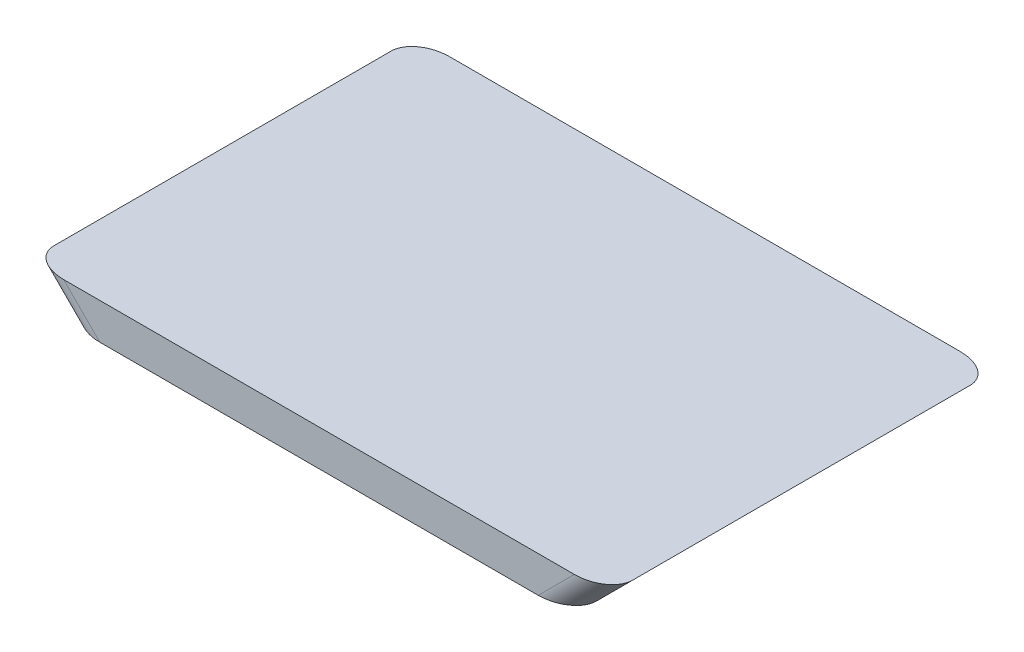
ISO-10303-21;
HEADER;
FILE_DESCRIPTION(('STEP AP214'),'2;1');
FILE_NAME('part.step','',(''),(''),'','','');
FILE_SCHEMA(('AUTOMOTIVE_DESIGN { 1 0 10303 214 1 1 1 1 }'));
ENDSEC;
DATA;
#1=APPLICATION_CONTEXT('core data for automotive mechanical design processes');
#2=APPLICATION_PROTOCOL_DEFINITION('international standard','automotive_design',2000,#1);
#3=PRODUCT_CONTEXT('',#1,'mechanical');
#4=PRODUCT('Part','Part','',(#3));
#5=PRODUCT_RELATED_PRODUCT_CATEGORY('part','',(#4));
#6=PRODUCT_DEFINITION_FORMATION('','',#4);
#7=PRODUCT_DEFINITION_CONTEXT('part definition',#1,'design');
#8=PRODUCT_DEFINITION('design','',#6,#7);
#9=PRODUCT_DEFINITION_SHAPE('','',#8);
#10=(LENGTH_UNIT() NAMED_UNIT(*) SI_UNIT(.MILLI.,.METRE.));
#11=(NAMED_UNIT(*) PLANE_ANGLE_UNIT() SI_UNIT($,.RADIAN.));
#12=(NAMED_UNIT(*) SI_UNIT($,.STERADIAN.) SOLID_ANGLE_UNIT());
#13=UNCERTAINTY_MEASURE_WITH_UNIT(LENGTH_MEASURE(1.E-05),#10,'distance_accuracy_value','');
#14=(GEOMETRIC_REPRESENTATION_CONTEXT(3) GLOBAL_UNCERTAINTY_ASSIGNED_CONTEXT((#13)) GLOBAL_UNIT_ASSIGNED_CONTEXT((#10,
#11,#12)) REPRESENTATION_CONTEXT('',''));
#15=CARTESIAN_POINT('',(0.,0.,0.));
#16=DIRECTION('',(0.,0.,1.));
#17=DIRECTION('',(1.,0.,0.));
#18=AXIS2_PLACEMENT_3D('',#15,#16,#17);
#19=CARTESIAN_POINT('',(-38.1,2.38125000000005,50.8));
#20=DIRECTION('',(0.707106781186564,0.707106781186531,0.));
#21=DIRECTION('',(-0.707106781186531,0.707106781186564,0.));
#22=AXIS2_PLACEMENT_3D('',#19,#20,#21);
#23=PLANE('',#22);
#24=DIRECTION('',(0.,0.,-1.));
#25=VECTOR('',#24,1.);
#26=CARTESIAN_POINT('',(-33.3375000000002,-2.38125,50.8));
#27=LINE('',#26,#25);
#28=CARTESIAN_POINT('',(-33.3375000000002,-2.38125,47.625));
#29=VERTEX_POINT('',#28);
#30=CARTESIAN_POINT('',(-33.3375000000002,-2.38125,3.175));
#31=VERTEX_POINT('',#30);
#32=EDGE_CURVE('E126',#29,#31,#27,.T.);
#33=ORIENTED_EDGE('',*,*,#32,.F.);
#34=DIRECTION('',(0.707106781186531,-0.707106781186564,0.));
#35=VECTOR('',#34,1.);
#36=CARTESIAN_POINT('',(-38.1,2.38125000000005,47.625));
#37=LINE('',#36,#35);
#38=CARTESIAN_POINT('',(-38.1,2.38125000000005,47.625));
#39=VERTEX_POINT('',#38);
#40=EDGE_CURVE('E113',#29,#39,#37,.F.);
#41=ORIENTED_EDGE('',*,*,#40,.T.);
#42=DIRECTION('',(0.,0.,-1.));
#43=VECTOR('',#42,1.);
#44=CARTESIAN_POINT('',(-38.1,2.38125000000005,50.8));
#45=LINE('',#44,#43);
#46=CARTESIAN_POINT('',(-38.1,2.38125000000005,3.175));
#47=VERTEX_POINT('',#46);
#48=EDGE_CURVE('E133',#39,#47,#45,.T.);
#49=ORIENTED_EDGE('',*,*,#48,.T.);
#50=DIRECTION('',(0.707106781186531,-0.707106781186564,0.));
#51=VECTOR('',#50,1.);
#52=CARTESIAN_POINT('',(-33.3375000000002,-2.38125,3.175));
#53=LINE('',#52,#51);
#54=EDGE_CURVE('E168',#47,#31,#53,.T.);
#55=ORIENTED_EDGE('',*,*,#54,.T.);
#56=EDGE_LOOP('',(#33,#41,#49,#55));
#57=FACE_BOUND('',#56,.T.);
#58=ADVANCED_FACE('F43',(#57),#23,.F.);
#59=CARTESIAN_POINT('',(-33.3375000000002,-2.38125,50.8));
#60=DIRECTION('',(0.,1.,0.));
#61=DIRECTION('',(0.,0.,1.));
#62=AXIS2_PLACEMENT_3D('',#59,#60,#61);
#63=PLANE('',#62);
#64=DIRECTION('',(0.,0.,-1.));
#65=VECTOR('',#64,1.);
#66=CARTESIAN_POINT('',(33.3374999999999,-2.38125,50.8));
#67=LINE('',#66,#65);
#68=CARTESIAN_POINT('',(33.3374999999999,-2.38125,47.625));
#69=VERTEX_POINT('',#68);
#70=CARTESIAN_POINT('',(33.3374999999999,-2.38125,3.175));
#71=VERTEX_POINT('',#70);
#72=EDGE_CURVE('E146',#69,#71,#67,.T.);
#73=ORIENTED_EDGE('',*,*,#72,.F.);
#74=CARTESIAN_POINT('',(28.8473719394653,-2.38125,47.625));
#75=DIRECTION('',(0.,1.,0.));
#76=DIRECTION('',(1.,0.,0.));
#77=AXIS2_PLACEMENT_3D('',#74,#75,#76);
#78=ELLIPSE('',#77,4.4901280605346,3.175);
#79=CARTESIAN_POINT('',(28.8473719394653,-2.38125,50.8));
#80=VERTEX_POINT('',#79);
#81=EDGE_CURVE('E114',#69,#80,#78,.F.);
#82=ORIENTED_EDGE('',*,*,#81,.T.);
#83=DIRECTION('',(1.,0.,0.));
#84=VECTOR('',#83,1.);
#85=CARTESIAN_POINT('',(-33.3375000000002,-2.38125,50.8));
#86=LINE('',#85,#84);
#87=CARTESIAN_POINT('',(-28.8473719394657,-2.38125,50.8));
#88=VERTEX_POINT('',#87);
#89=EDGE_CURVE('E121',#88,#80,#86,.T.);
#90=ORIENTED_EDGE('',*,*,#89,.F.);
#91=CARTESIAN_POINT('',(-28.8473719394657,-2.38125,47.625));
#92=DIRECTION('',(0.,1.,0.));
#93=DIRECTION('',(1.,0.,0.));
#94=AXIS2_PLACEMENT_3D('',#91,#92,#93);
#95=ELLIPSE('',#94,4.49012806053447,3.175);
#96=EDGE_CURVE('E66',#88,#29,#95,.F.);
#97=ORIENTED_EDGE('',*,*,#96,.T.);
#98=ORIENTED_EDGE('',*,*,#32,.T.);
#99=CARTESIAN_POINT('',(-28.8473719394657,-2.38125,3.175));
#100=DIRECTION('',(0.,1.,0.));
#101=DIRECTION('',(-1.,0.,0.));
#102=AXIS2_PLACEMENT_3D('',#99,#100,#101);
#103=ELLIPSE('',#102,4.49012806053447,3.175);
#104=CARTESIAN_POINT('',(-28.8473719394657,-2.38125,0.));
#105=VERTEX_POINT('',#104);
#106=EDGE_CURVE('E58',#31,#105,#103,.F.);
#107=ORIENTED_EDGE('',*,*,#106,.T.);
#108=DIRECTION('',(1.,0.,0.));
#109=VECTOR('',#108,1.);
#110=CARTESIAN_POINT('',(-33.3375000000002,-2.38125,0.));
#111=LINE('',#110,#109);
#112=CARTESIAN_POINT('',(28.8473719394653,-2.38125,0.));
#113=VERTEX_POINT('',#112);
#114=EDGE_CURVE('E136',#105,#113,#111,.T.);
#115=ORIENTED_EDGE('',*,*,#114,.T.);
#116=CARTESIAN_POINT('',(28.8473719394653,-2.38125,3.175));
#117=DIRECTION('',(0.,1.,0.));
#118=DIRECTION('',(-1.,0.,0.));
#119=AXIS2_PLACEMENT_3D('',#116,#117,#118);
#120=ELLIPSE('',#119,4.4901280605346,3.175);
#121=EDGE_CURVE('E164',#113,#71,#120,.F.);
#122=ORIENTED_EDGE('',*,*,#121,.T.);
#123=EDGE_LOOP('',(#73,#82,#90,#97,#98,#107,#115,#122));
#124=FACE_BOUND('',#123,.T.);
#125=ADVANCED_FACE('F129',(#124),#63,.F.);
#126=CARTESIAN_POINT('',(38.1,2.38125000000005,50.8));
#127=DIRECTION('',(-0.707106781186544,0.707106781186551,0.));
#128=DIRECTION('',(-0.707106781186551,-0.707106781186544,0.));
#129=AXIS2_PLACEMENT_3D('',#126,#127,#128);
#130=PLANE('',#129);
#131=DIRECTION('',(0.,0.,-1.));
#132=VECTOR('',#131,1.);
#133=CARTESIAN_POINT('',(38.1,2.38125000000005,50.8));
#134=LINE('',#133,#132);
#135=CARTESIAN_POINT('',(38.1,2.38125000000005,47.625));
#136=VERTEX_POINT('',#135);
#137=CARTESIAN_POINT('',(38.1,2.38125000000005,3.175));
#138=VERTEX_POINT('',#137);
#139=EDGE_CURVE('E143',#136,#138,#134,.T.);
#140=ORIENTED_EDGE('',*,*,#139,.F.);
#141=DIRECTION('',(0.707106781186551,0.707106781186544,0.));
#142=VECTOR('',#141,1.);
#143=CARTESIAN_POINT('',(38.1,2.38125000000005,47.625));
#144=LINE('',#143,#142);
#145=EDGE_CURVE('E162',#136,#69,#144,.F.);
#146=ORIENTED_EDGE('',*,*,#145,.T.);
#147=ORIENTED_EDGE('',*,*,#72,.T.);
#148=DIRECTION('',(0.707106781186551,0.707106781186544,0.));
#149=VECTOR('',#148,1.);
#150=CARTESIAN_POINT('',(38.1,2.38125000000005,3.175));
#151=LINE('',#150,#149);
#152=EDGE_CURVE('E159',#71,#138,#151,.T.);
#153=ORIENTED_EDGE('',*,*,#152,.T.);
#154=EDGE_LOOP('',(#140,#146,#147,#153));
#155=FACE_BOUND('',#154,.T.);
#156=ADVANCED_FACE('F180',(#155),#130,.F.);
#157=CARTESIAN_POINT('',(-38.1,2.38125000000005,50.8));
#158=DIRECTION('',(0.,-1.,0.));
#159=DIRECTION('',(0.,0.,-1.));
#160=AXIS2_PLACEMENT_3D('',#157,#158,#159);
#161=PLANE('',#160);
#162=DIRECTION('',(-1.,0.,0.));
#163=VECTOR('',#162,1.);
#164=CARTESIAN_POINT('',(-38.1,2.38125000000005,50.8));
#165=LINE('',#164,#163);
#166=CARTESIAN_POINT('',(33.6098719394654,2.38125000000005,50.8));
#167=VERTEX_POINT('',#166);
#168=CARTESIAN_POINT('',(-33.6098719394655,2.38125000000005,50.8));
#169=VERTEX_POINT('',#168);
#170=EDGE_CURVE('E124',#167,#169,#165,.T.);
#171=ORIENTED_EDGE('',*,*,#170,.F.);
#172=CARTESIAN_POINT('',(33.6098719394654,2.38125000000006,47.625));
#173=DIRECTION('',(0.,-1.,0.));
#174=DIRECTION('',(1.,0.,0.));
#175=AXIS2_PLACEMENT_3D('',#172,#173,#174);
#176=ELLIPSE('',#175,4.4901280605346,3.175);
#177=EDGE_CURVE('E157',#167,#136,#176,.F.);
#178=ORIENTED_EDGE('',*,*,#177,.T.);
#179=ORIENTED_EDGE('',*,*,#139,.T.);
#180=CARTESIAN_POINT('',(33.6098719394654,2.38125000000005,3.175));
#181=DIRECTION('',(0.,-1.,0.));
#182=DIRECTION('',(-1.,0.,0.));
#183=AXIS2_PLACEMENT_3D('',#180,#181,#182);
#184=ELLIPSE('',#183,4.4901280605346,3.175);
#185=CARTESIAN_POINT('',(33.6098719394654,2.38125000000005,0.));
#186=VERTEX_POINT('',#185);
#187=EDGE_CURVE('E151',#138,#186,#184,.F.);
#188=ORIENTED_EDGE('',*,*,#187,.T.);
#189=DIRECTION('',(-1.,0.,0.));
#190=VECTOR('',#189,1.);
#191=CARTESIAN_POINT('',(-38.1,2.38125000000005,0.));
#192=LINE('',#191,#190);
#193=CARTESIAN_POINT('',(-33.6098719394655,2.38125000000005,0.));
#194=VERTEX_POINT('',#193);
#195=EDGE_CURVE('E131',#186,#194,#192,.T.);
#196=ORIENTED_EDGE('',*,*,#195,.T.);
#197=CARTESIAN_POINT('',(-33.6098719394655,2.38125000000005,3.175));
#198=DIRECTION('',(0.,-1.,0.));
#199=DIRECTION('',(-1.,0.,0.));
#200=AXIS2_PLACEMENT_3D('',#197,#198,#199);
#201=ELLIPSE('',#200,4.49012806053447,3.175);
#202=EDGE_CURVE('E153',#194,#47,#201,.F.);
#203=ORIENTED_EDGE('',*,*,#202,.T.);
#204=ORIENTED_EDGE('',*,*,#48,.F.);
#205=CARTESIAN_POINT('',(-33.6098719394655,2.38125000000006,47.625));
#206=DIRECTION('',(0.,-1.,0.));
#207=DIRECTION('',(1.,0.,0.));
#208=AXIS2_PLACEMENT_3D('',#205,#206,#207);
#209=ELLIPSE('',#208,4.49012806053447,3.175);
#210=EDGE_CURVE('E155',#39,#169,#209,.F.);
#211=ORIENTED_EDGE('',*,*,#210,.T.);
#212=EDGE_LOOP('',(#171,#178,#179,#188,#196,#203,#204,#211));
#213=FACE_BOUND('',#212,.T.);
#214=ADVANCED_FACE('F183',(#213),#161,.F.);
#215=CARTESIAN_POINT('',(0.,0.,50.8));
#216=DIRECTION('',(0.,0.,-1.));
#217=DIRECTION('',(-1.,0.,0.));
#218=AXIS2_PLACEMENT_3D('',#215,#216,#217);
#219=PLANE('',#218);
#220=ORIENTED_EDGE('',*,*,#89,.T.);
#221=DIRECTION('',(0.707106781186551,0.707106781186544,0.));
#222=VECTOR('',#221,1.);
#223=CARTESIAN_POINT('',(15.6143109697325,-15.6143109697327,50.8));
#224=LINE('',#223,#222);
#225=EDGE_CURVE('E125',#80,#167,#224,.T.);
#226=ORIENTED_EDGE('',*,*,#225,.T.);
#227=ORIENTED_EDGE('',*,*,#170,.T.);
#228=DIRECTION('',(0.707106781186531,-0.707106781186564,0.));
#229=VECTOR('',#228,1.);
#230=CARTESIAN_POINT('',(-15.6143109697335,-15.6143109697328,50.8));
#231=LINE('',#230,#229);
#232=EDGE_CURVE('E112',#169,#88,#231,.T.);
#233=ORIENTED_EDGE('',*,*,#232,.T.);
#234=EDGE_LOOP('',(#220,#226,#227,#233));
#235=FACE_BOUND('',#234,.T.);
#236=ADVANCED_FACE('F119',(#235),#219,.F.);
#237=CARTESIAN_POINT('',(0.,0.,0.));
#238=DIRECTION('',(0.,0.,-1.));
#239=DIRECTION('',(-1.,0.,0.));
#240=AXIS2_PLACEMENT_3D('',#237,#238,#239);
#241=PLANE('',#240);
#242=ORIENTED_EDGE('',*,*,#114,.F.);
#243=DIRECTION('',(0.707106781186531,-0.707106781186564,0.));
#244=VECTOR('',#243,1.);
#245=CARTESIAN_POINT('',(-35.8549359697327,4.62631403026729,0.));
#246=LINE('',#245,#244);
#247=EDGE_CURVE('E11',#105,#194,#246,.F.);
#248=ORIENTED_EDGE('',*,*,#247,.T.);
#249=ORIENTED_EDGE('',*,*,#195,.F.);
#250=DIRECTION('',(0.707106781186551,0.707106781186544,0.));
#251=VECTOR('',#250,1.);
#252=CARTESIAN_POINT('',(31.0924359697326,-0.1361859697327,0.));
#253=LINE('',#252,#251);
#254=EDGE_CURVE('E51',#186,#113,#253,.F.);
#255=ORIENTED_EDGE('',*,*,#254,.T.);
#256=EDGE_LOOP('',(#242,#248,#249,#255));
#257=FACE_BOUND('',#256,.T.);
#258=ADVANCED_FACE('F174',(#257),#241,.T.);
#259=CARTESIAN_POINT('',(15.6143109697325,-15.6143109697327,47.625));
#260=DIRECTION('',(0.707106781186551,0.707106781186544,0.));
#261=DIRECTION('',(-0.707106781186544,0.707106781186551,0.));
#262=AXIS2_PLACEMENT_3D('',#259,#260,#261);
#263=CYLINDRICAL_SURFACE('',#262,3.175);
#264=ORIENTED_EDGE('',*,*,#81,.F.);
#265=ORIENTED_EDGE('',*,*,#145,.F.);
#266=ORIENTED_EDGE('',*,*,#177,.F.);
#267=ORIENTED_EDGE('',*,*,#225,.F.);
#268=EDGE_LOOP('',(#264,#265,#266,#267));
#269=FACE_BOUND('',#268,.T.);
#270=ADVANCED_FACE('F185',(#269),#263,.T.);
#271=CARTESIAN_POINT('',(-15.6143109697335,-15.6143109697328,47.625));
#272=DIRECTION('',(0.707106781186531,-0.707106781186564,0.));
#273=DIRECTION('',(0.707106781186564,0.707106781186531,0.));
#274=AXIS2_PLACEMENT_3D('',#271,#272,#273);
#275=CYLINDRICAL_SURFACE('',#274,3.175);
#276=ORIENTED_EDGE('',*,*,#210,.F.);
#277=ORIENTED_EDGE('',*,*,#40,.F.);
#278=ORIENTED_EDGE('',*,*,#96,.F.);
#279=ORIENTED_EDGE('',*,*,#232,.F.);
#280=EDGE_LOOP('',(#276,#277,#278,#279));
#281=FACE_BOUND('',#280,.T.);
#282=ADVANCED_FACE('F111',(#281),#275,.T.);
#283=CARTESIAN_POINT('',(-35.8549359697327,4.62631403026729,3.175));
#284=DIRECTION('',(-0.707106781186531,0.707106781186564,0.));
#285=DIRECTION('',(-0.707106781186564,-0.707106781186531,0.));
#286=AXIS2_PLACEMENT_3D('',#283,#284,#285);
#287=CYLINDRICAL_SURFACE('',#286,3.175);
#288=ORIENTED_EDGE('',*,*,#202,.F.);
#289=ORIENTED_EDGE('',*,*,#247,.F.);
#290=ORIENTED_EDGE('',*,*,#106,.F.);
#291=ORIENTED_EDGE('',*,*,#54,.F.);
#292=EDGE_LOOP('',(#288,#289,#290,#291));
#293=FACE_BOUND('',#292,.T.);
#294=ADVANCED_FACE('F192',(#293),#287,.T.);
#295=CARTESIAN_POINT('',(35.8549359697327,4.62631403026735,3.175));
#296=DIRECTION('',(-0.707106781186551,-0.707106781186544,0.));
#297=DIRECTION('',(0.707106781186544,-0.707106781186551,0.));
#298=AXIS2_PLACEMENT_3D('',#295,#296,#297);
#299=CYLINDRICAL_SURFACE('',#298,3.175);
#300=ORIENTED_EDGE('',*,*,#121,.F.);
#301=ORIENTED_EDGE('',*,*,#254,.F.);
#302=ORIENTED_EDGE('',*,*,#187,.F.);
#303=ORIENTED_EDGE('',*,*,#152,.F.);
#304=EDGE_LOOP('',(#300,#301,#302,#303));
#305=FACE_BOUND('',#304,.T.);
#306=ADVANCED_FACE('F45',(#305),#299,.T.);
#307=CLOSED_SHELL('',(#58,#125,#156,#214,#236,#258,#270,#282,#294,#306));
#308=MANIFOLD_SOLID_BREP('B2',#307);
#309=ADVANCED_BREP_SHAPE_REPRESENTATION('',(#18,#308),#14);
#310=SHAPE_DEFINITION_REPRESENTATION(#9,#309);
ENDSEC;
END-ISO-10303-21;
